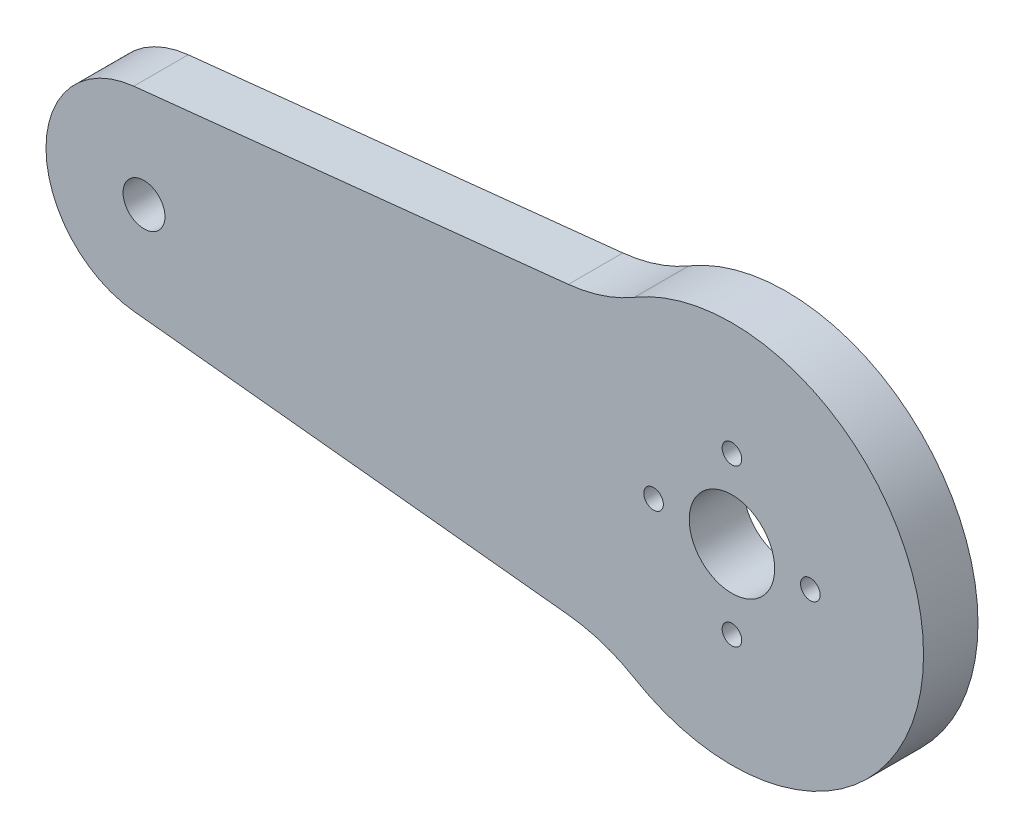
ISO-10303-21;
HEADER;
FILE_DESCRIPTION(('STEP AP214'),'2;1');
FILE_NAME('part.step','',(''),(''),'','','');
FILE_SCHEMA(('AUTOMOTIVE_DESIGN { 1 0 10303 214 1 1 1 1 }'));
ENDSEC;
DATA;
#1=APPLICATION_CONTEXT('core data for automotive mechanical design processes');
#2=APPLICATION_PROTOCOL_DEFINITION('international standard','automotive_design',2000,#1);
#3=PRODUCT_CONTEXT('',#1,'mechanical');
#4=PRODUCT('Part','Part','',(#3));
#5=PRODUCT_RELATED_PRODUCT_CATEGORY('part','',(#4));
#6=PRODUCT_DEFINITION_FORMATION('','',#4);
#7=PRODUCT_DEFINITION_CONTEXT('part definition',#1,'design');
#8=PRODUCT_DEFINITION('design','',#6,#7);
#9=PRODUCT_DEFINITION_SHAPE('','',#8);
#10=(LENGTH_UNIT() NAMED_UNIT(*) SI_UNIT(.MILLI.,.METRE.));
#11=(NAMED_UNIT(*) PLANE_ANGLE_UNIT() SI_UNIT($,.RADIAN.));
#12=(NAMED_UNIT(*) SI_UNIT($,.STERADIAN.) SOLID_ANGLE_UNIT());
#13=UNCERTAINTY_MEASURE_WITH_UNIT(LENGTH_MEASURE(1.E-05),#10,'distance_accuracy_value','');
#14=(GEOMETRIC_REPRESENTATION_CONTEXT(3) GLOBAL_UNCERTAINTY_ASSIGNED_CONTEXT((#13)) GLOBAL_UNIT_ASSIGNED_CONTEXT((#10,
#11,#12)) REPRESENTATION_CONTEXT('',''));
#15=CARTESIAN_POINT('',(0.,0.,0.));
#16=DIRECTION('',(0.,0.,1.));
#17=DIRECTION('',(1.,0.,0.));
#18=AXIS2_PLACEMENT_3D('',#15,#16,#17);
#19=CARTESIAN_POINT('',(-54.,0.,5.));
#20=DIRECTION('',(0.,0.,1.));
#21=DIRECTION('',(1.,0.,0.));
#22=AXIS2_PLACEMENT_3D('',#19,#20,#21);
#23=PLANE('',#22);
#24=CARTESIAN_POINT('',(-16.5876350630029,28.0643967157079,5.));
#25=DIRECTION('',(0.,0.,-1.));
#26=DIRECTION('',(-1.,0.,0.));
#27=AXIS2_PLACEMENT_3D('',#24,#25,#26);
#28=CIRCLE('',#27,15.);
#29=CARTESIAN_POINT('',(-8.95528764137578,15.1513307422227,5.));
#30=VERTEX_POINT('',#29);
#31=CARTESIAN_POINT('',(-15.0197081139881,13.1465682851838,5.));
#32=VERTEX_POINT('',#31);
#33=EDGE_CURVE('E93',#30,#32,#28,.T.);
#34=ORIENTED_EDGE('',*,*,#33,.T.);
#35=DIRECTION('',(0.994521895368273,0.104528463267654,0.));
#36=VECTOR('',#35,1.);
#37=CARTESIAN_POINT('',(-54.9407561694089,8.95069705831445,5.));
#38=LINE('',#37,#36);
#39=CARTESIAN_POINT('',(-54.9407561694089,8.95069705831446,5.));
#40=VERTEX_POINT('',#39);
#41=EDGE_CURVE('E102',#32,#40,#38,.F.);
#42=ORIENTED_EDGE('',*,*,#41,.T.);
#43=CARTESIAN_POINT('',(-54.,0.,5.));
#44=DIRECTION('',(0.,0.,-1.));
#45=DIRECTION('',(-1.,0.,0.));
#46=AXIS2_PLACEMENT_3D('',#43,#44,#45);
#47=CIRCLE('',#46,9.);
#48=CARTESIAN_POINT('',(-54.9407561694089,-8.95069705831446,5.));
#49=VERTEX_POINT('',#48);
#50=EDGE_CURVE('E105',#49,#40,#47,.T.);
#51=ORIENTED_EDGE('',*,*,#50,.F.);
#52=DIRECTION('',(-0.994521895368273,0.104528463267653,0.));
#53=VECTOR('',#52,1.);
#54=CARTESIAN_POINT('',(-54.9407561694089,-8.95069705831446,5.));
#55=LINE('',#54,#53);
#56=CARTESIAN_POINT('',(-15.0197081139882,-13.1465682851838,5.));
#57=VERTEX_POINT('',#56);
#58=EDGE_CURVE('E83',#49,#57,#55,.F.);
#59=ORIENTED_EDGE('',*,*,#58,.T.);
#60=CARTESIAN_POINT('',(-16.587635063003,-28.0643967157079,5.));
#61=DIRECTION('',(0.,0.,-1.));
#62=DIRECTION('',(-1.,0.,0.));
#63=AXIS2_PLACEMENT_3D('',#60,#61,#62);
#64=CIRCLE('',#63,15.);
#65=CARTESIAN_POINT('',(-8.95528764137584,-15.1513307422226,5.));
#66=VERTEX_POINT('',#65);
#67=EDGE_CURVE('E77',#57,#66,#64,.T.);
#68=ORIENTED_EDGE('',*,*,#67,.T.);
#69=CARTESIAN_POINT('',(0.,0.,5.));
#70=DIRECTION('',(0.,0.,-1.));
#71=DIRECTION('',(-1.,0.,0.));
#72=AXIS2_PLACEMENT_3D('',#69,#70,#71);
#73=CIRCLE('',#72,17.6);
#74=EDGE_CURVE('E67',#30,#66,#73,.T.);
#75=ORIENTED_EDGE('',*,*,#74,.F.);
#76=EDGE_LOOP('',(#34,#42,#51,#59,#68,#75));
#77=FACE_BOUND('',#76,.T.);
#78=CARTESIAN_POINT('',(0.,0.,5.));
#79=DIRECTION('',(0.,0.,1.));
#80=DIRECTION('',(1.,0.,0.));
#81=AXIS2_PLACEMENT_3D('',#78,#79,#80);
#82=CIRCLE('',#81,3.925);
#83=CARTESIAN_POINT('',(3.925,0.,5.));
#84=VERTEX_POINT('',#83);
#85=EDGE_CURVE('E101',#84,#84,#82,.F.);
#86=ORIENTED_EDGE('',*,*,#85,.T.);
#87=EDGE_LOOP('',(#86));
#88=FACE_BOUND('',#87,.T.);
#89=CARTESIAN_POINT('',(-54.,0.,5.));
#90=DIRECTION('',(0.,0.,1.));
#91=DIRECTION('',(1.,0.,0.));
#92=AXIS2_PLACEMENT_3D('',#89,#90,#91);
#93=CIRCLE('',#92,1.925);
#94=CARTESIAN_POINT('',(-52.075,0.,5.));
#95=VERTEX_POINT('',#94);
#96=EDGE_CURVE('E138',#95,#95,#93,.F.);
#97=ORIENTED_EDGE('',*,*,#96,.T.);
#98=EDGE_LOOP('',(#97));
#99=FACE_BOUND('',#98,.T.);
#100=CARTESIAN_POINT('',(0.,7.2,5.));
#101=DIRECTION('',(0.,0.,1.));
#102=DIRECTION('',(1.,0.,0.));
#103=AXIS2_PLACEMENT_3D('',#100,#101,#102);
#104=CIRCLE('',#103,0.9);
#105=CARTESIAN_POINT('',(0.9,7.2,5.));
#106=VERTEX_POINT('',#105);
#107=EDGE_CURVE('E141',#106,#106,#104,.F.);
#108=ORIENTED_EDGE('',*,*,#107,.T.);
#109=EDGE_LOOP('',(#108));
#110=FACE_BOUND('',#109,.T.);
#111=CARTESIAN_POINT('',(0.,-7.2,5.));
#112=DIRECTION('',(0.,0.,1.));
#113=DIRECTION('',(1.,0.,0.));
#114=AXIS2_PLACEMENT_3D('',#111,#112,#113);
#115=CIRCLE('',#114,0.9);
#116=CARTESIAN_POINT('',(0.9,-7.2,5.));
#117=VERTEX_POINT('',#116);
#118=EDGE_CURVE('E144',#117,#117,#115,.F.);
#119=ORIENTED_EDGE('',*,*,#118,.T.);
#120=EDGE_LOOP('',(#119));
#121=FACE_BOUND('',#120,.T.);
#122=CARTESIAN_POINT('',(7.2,0.,5.));
#123=DIRECTION('',(0.,0.,1.));
#124=DIRECTION('',(1.,0.,0.));
#125=AXIS2_PLACEMENT_3D('',#122,#123,#124);
#126=CIRCLE('',#125,0.9);
#127=CARTESIAN_POINT('',(8.1,0.,5.));
#128=VERTEX_POINT('',#127);
#129=EDGE_CURVE('E146',#128,#128,#126,.F.);
#130=ORIENTED_EDGE('',*,*,#129,.T.);
#131=EDGE_LOOP('',(#130));
#132=FACE_BOUND('',#131,.T.);
#133=CARTESIAN_POINT('',(-7.2,0.,5.));
#134=DIRECTION('',(0.,0.,1.));
#135=DIRECTION('',(1.,0.,0.));
#136=AXIS2_PLACEMENT_3D('',#133,#134,#135);
#137=CIRCLE('',#136,0.9);
#138=CARTESIAN_POINT('',(-6.3,0.,5.));
#139=VERTEX_POINT('',#138);
#140=EDGE_CURVE('E20',#139,#139,#137,.F.);
#141=ORIENTED_EDGE('',*,*,#140,.T.);
#142=EDGE_LOOP('',(#141));
#143=FACE_BOUND('',#142,.T.);
#144=ADVANCED_FACE('F17',(#77,#88,#99,#110,#121,#132,#143),#23,.T.);
#145=CARTESIAN_POINT('',(-7.2,0.,-0.799999999999999));
#146=DIRECTION('',(0.,0.,1.));
#147=DIRECTION('',(1.,0.,0.));
#148=AXIS2_PLACEMENT_3D('',#145,#146,#147);
#149=CYLINDRICAL_SURFACE('',#148,0.9);
#150=CARTESIAN_POINT('',(-7.2,0.,0.));
#151=DIRECTION('',(0.,0.,1.));
#152=DIRECTION('',(1.,0.,0.));
#153=AXIS2_PLACEMENT_3D('',#150,#151,#152);
#154=CIRCLE('',#153,0.9);
#155=CARTESIAN_POINT('',(-6.3,0.,0.));
#156=VERTEX_POINT('',#155);
#157=EDGE_CURVE('E130',#156,#156,#154,.F.);
#158=ORIENTED_EDGE('',*,*,#157,.T.);
#159=EDGE_LOOP('',(#158));
#160=FACE_BOUND('',#159,.T.);
#161=ORIENTED_EDGE('',*,*,#140,.F.);
#162=EDGE_LOOP('',(#161));
#163=FACE_BOUND('',#162,.T.);
#164=ADVANCED_FACE('F154',(#160,#163),#149,.F.);
#165=CARTESIAN_POINT('',(7.2,0.,-0.799999999999999));
#166=DIRECTION('',(0.,0.,1.));
#167=DIRECTION('',(1.,0.,0.));
#168=AXIS2_PLACEMENT_3D('',#165,#166,#167);
#169=CYLINDRICAL_SURFACE('',#168,0.9);
#170=CARTESIAN_POINT('',(7.2,0.,0.));
#171=DIRECTION('',(0.,0.,1.));
#172=DIRECTION('',(1.,0.,0.));
#173=AXIS2_PLACEMENT_3D('',#170,#171,#172);
#174=CIRCLE('',#173,0.9);
#175=CARTESIAN_POINT('',(8.1,0.,0.));
#176=VERTEX_POINT('',#175);
#177=EDGE_CURVE('E127',#176,#176,#174,.F.);
#178=ORIENTED_EDGE('',*,*,#177,.T.);
#179=EDGE_LOOP('',(#178));
#180=FACE_BOUND('',#179,.T.);
#181=ORIENTED_EDGE('',*,*,#129,.F.);
#182=EDGE_LOOP('',(#181));
#183=FACE_BOUND('',#182,.T.);
#184=ADVANCED_FACE('F156',(#180,#183),#169,.F.);
#185=CARTESIAN_POINT('',(0.,-7.2,-0.799999999999999));
#186=DIRECTION('',(0.,0.,1.));
#187=DIRECTION('',(1.,0.,0.));
#188=AXIS2_PLACEMENT_3D('',#185,#186,#187);
#189=CYLINDRICAL_SURFACE('',#188,0.9);
#190=CARTESIAN_POINT('',(0.,-7.2,0.));
#191=DIRECTION('',(0.,0.,1.));
#192=DIRECTION('',(1.,0.,0.));
#193=AXIS2_PLACEMENT_3D('',#190,#191,#192);
#194=CIRCLE('',#193,0.9);
#195=CARTESIAN_POINT('',(0.9,-7.2,0.));
#196=VERTEX_POINT('',#195);
#197=EDGE_CURVE('E124',#196,#196,#194,.F.);
#198=ORIENTED_EDGE('',*,*,#197,.T.);
#199=EDGE_LOOP('',(#198));
#200=FACE_BOUND('',#199,.T.);
#201=ORIENTED_EDGE('',*,*,#118,.F.);
#202=EDGE_LOOP('',(#201));
#203=FACE_BOUND('',#202,.T.);
#204=ADVANCED_FACE('F163',(#200,#203),#189,.F.);
#205=CARTESIAN_POINT('',(0.,7.2,-0.799999999999999));
#206=DIRECTION('',(0.,0.,1.));
#207=DIRECTION('',(1.,0.,0.));
#208=AXIS2_PLACEMENT_3D('',#205,#206,#207);
#209=CYLINDRICAL_SURFACE('',#208,0.9);
#210=CARTESIAN_POINT('',(0.,7.2,0.));
#211=DIRECTION('',(0.,0.,1.));
#212=DIRECTION('',(1.,0.,0.));
#213=AXIS2_PLACEMENT_3D('',#210,#211,#212);
#214=CIRCLE('',#213,0.9);
#215=CARTESIAN_POINT('',(0.9,7.2,0.));
#216=VERTEX_POINT('',#215);
#217=EDGE_CURVE('E121',#216,#216,#214,.F.);
#218=ORIENTED_EDGE('',*,*,#217,.T.);
#219=EDGE_LOOP('',(#218));
#220=FACE_BOUND('',#219,.T.);
#221=ORIENTED_EDGE('',*,*,#107,.F.);
#222=EDGE_LOOP('',(#221));
#223=FACE_BOUND('',#222,.T.);
#224=ADVANCED_FACE('F200',(#220,#223),#209,.F.);
#225=CARTESIAN_POINT('',(-54.,0.,-0.799999999999999));
#226=DIRECTION('',(0.,0.,1.));
#227=DIRECTION('',(1.,0.,0.));
#228=AXIS2_PLACEMENT_3D('',#225,#226,#227);
#229=CYLINDRICAL_SURFACE('',#228,1.925);
#230=CARTESIAN_POINT('',(-54.,0.,0.));
#231=DIRECTION('',(0.,0.,1.));
#232=DIRECTION('',(1.,0.,0.));
#233=AXIS2_PLACEMENT_3D('',#230,#231,#232);
#234=CIRCLE('',#233,1.925);
#235=CARTESIAN_POINT('',(-52.075,0.,0.));
#236=VERTEX_POINT('',#235);
#237=EDGE_CURVE('E118',#236,#236,#234,.F.);
#238=ORIENTED_EDGE('',*,*,#237,.T.);
#239=EDGE_LOOP('',(#238));
#240=FACE_BOUND('',#239,.T.);
#241=ORIENTED_EDGE('',*,*,#96,.F.);
#242=EDGE_LOOP('',(#241));
#243=FACE_BOUND('',#242,.T.);
#244=ADVANCED_FACE('F196',(#240,#243),#229,.F.);
#245=CARTESIAN_POINT('',(0.,0.,-0.799999999999999));
#246=DIRECTION('',(0.,0.,1.));
#247=DIRECTION('',(1.,0.,0.));
#248=AXIS2_PLACEMENT_3D('',#245,#246,#247);
#249=CYLINDRICAL_SURFACE('',#248,3.925);
#250=CARTESIAN_POINT('',(0.,0.,0.));
#251=DIRECTION('',(0.,0.,1.));
#252=DIRECTION('',(1.,0.,0.));
#253=AXIS2_PLACEMENT_3D('',#250,#251,#252);
#254=CIRCLE('',#253,3.925);
#255=CARTESIAN_POINT('',(3.925,0.,0.));
#256=VERTEX_POINT('',#255);
#257=EDGE_CURVE('E115',#256,#256,#254,.F.);
#258=ORIENTED_EDGE('',*,*,#257,.T.);
#259=EDGE_LOOP('',(#258));
#260=FACE_BOUND('',#259,.T.);
#261=ORIENTED_EDGE('',*,*,#85,.F.);
#262=EDGE_LOOP('',(#261));
#263=FACE_BOUND('',#262,.T.);
#264=ADVANCED_FACE('F192',(#260,#263),#249,.F.);
#265=CARTESIAN_POINT('',(-54.9407561694089,-8.95069705831446,5.));
#266=DIRECTION('',(0.104528463267653,0.994521895368273,0.));
#267=DIRECTION('',(-0.994521895368273,0.104528463267653,0.));
#268=AXIS2_PLACEMENT_3D('',#265,#266,#267);
#269=PLANE('',#268);
#270=DIRECTION('',(0.,0.,-1.));
#271=VECTOR('',#270,1.);
#272=CARTESIAN_POINT('',(-15.0197081139882,-13.1465682851838,5.));
#273=LINE('',#272,#271);
#274=CARTESIAN_POINT('',(-15.0197081139882,-13.1465682851838,0.));
#275=VERTEX_POINT('',#274);
#276=EDGE_CURVE('E86',#275,#57,#273,.F.);
#277=ORIENTED_EDGE('',*,*,#276,.T.);
#278=ORIENTED_EDGE('',*,*,#58,.F.);
#279=DIRECTION('',(0.,0.,1.));
#280=VECTOR('',#279,1.);
#281=CARTESIAN_POINT('',(-54.9407561694089,-8.95069705831446,5.));
#282=LINE('',#281,#280);
#283=CARTESIAN_POINT('',(-54.9407561694089,-8.95069705831446,0.));
#284=VERTEX_POINT('',#283);
#285=EDGE_CURVE('E98',#284,#49,#282,.T.);
#286=ORIENTED_EDGE('',*,*,#285,.F.);
#287=DIRECTION('',(0.994521895368273,-0.104528463267653,0.));
#288=VECTOR('',#287,1.);
#289=CARTESIAN_POINT('',(-54.9407561694089,-8.95069705831446,0.));
#290=LINE('',#289,#288);
#291=EDGE_CURVE('E113',#284,#275,#290,.T.);
#292=ORIENTED_EDGE('',*,*,#291,.T.);
#293=EDGE_LOOP('',(#277,#278,#286,#292));
#294=FACE_BOUND('',#293,.T.);
#295=ADVANCED_FACE('F189',(#294),#269,.F.);
#296=CARTESIAN_POINT('',(-16.587635063003,-28.0643967157079,5.));
#297=DIRECTION('',(0.,0.,-1.));
#298=DIRECTION('',(-1.,0.,0.));
#299=AXIS2_PLACEMENT_3D('',#296,#297,#298);
#300=CYLINDRICAL_SURFACE('',#299,15.);
#301=ORIENTED_EDGE('',*,*,#276,.F.);
#302=CARTESIAN_POINT('',(-16.587635063003,-28.0643967157079,0.));
#303=DIRECTION('',(0.,0.,-1.));
#304=DIRECTION('',(-1.,0.,0.));
#305=AXIS2_PLACEMENT_3D('',#302,#303,#304);
#306=CIRCLE('',#305,15.);
#307=CARTESIAN_POINT('',(-8.95528764137584,-15.1513307422226,0.));
#308=VERTEX_POINT('',#307);
#309=EDGE_CURVE('E91',#275,#308,#306,.T.);
#310=ORIENTED_EDGE('',*,*,#309,.T.);
#311=DIRECTION('',(0.,0.,-1.));
#312=VECTOR('',#311,1.);
#313=CARTESIAN_POINT('',(-8.95528764137583,-15.1513307422227,5.));
#314=LINE('',#313,#312);
#315=EDGE_CURVE('E72',#66,#308,#314,.T.);
#316=ORIENTED_EDGE('',*,*,#315,.F.);
#317=ORIENTED_EDGE('',*,*,#67,.F.);
#318=EDGE_LOOP('',(#301,#310,#316,#317));
#319=FACE_BOUND('',#318,.T.);
#320=ADVANCED_FACE('F89',(#319),#300,.F.);
#321=CARTESIAN_POINT('',(0.,0.,5.));
#322=DIRECTION('',(0.,0.,-1.));
#323=DIRECTION('',(-1.,0.,0.));
#324=AXIS2_PLACEMENT_3D('',#321,#322,#323);
#325=CYLINDRICAL_SURFACE('',#324,17.6);
#326=CARTESIAN_POINT('',(0.,0.,0.));
#327=DIRECTION('',(0.,0.,-1.));
#328=DIRECTION('',(-1.,0.,0.));
#329=AXIS2_PLACEMENT_3D('',#326,#327,#328);
#330=CIRCLE('',#329,17.6);
#331=CARTESIAN_POINT('',(-8.95528764137578,15.1513307422227,0.));
#332=VERTEX_POINT('',#331);
#333=EDGE_CURVE('E110',#308,#332,#330,.F.);
#334=ORIENTED_EDGE('',*,*,#333,.T.);
#335=DIRECTION('',(0.,0.,-1.));
#336=VECTOR('',#335,1.);
#337=CARTESIAN_POINT('',(-8.95528764137578,15.1513307422227,5.));
#338=LINE('',#337,#336);
#339=EDGE_CURVE('E74',#332,#30,#338,.F.);
#340=ORIENTED_EDGE('',*,*,#339,.T.);
#341=ORIENTED_EDGE('',*,*,#74,.T.);
#342=ORIENTED_EDGE('',*,*,#315,.T.);
#343=EDGE_LOOP('',(#334,#340,#341,#342));
#344=FACE_BOUND('',#343,.T.);
#345=ADVANCED_FACE('F70',(#344),#325,.T.);
#346=CARTESIAN_POINT('',(-16.5876350630029,28.0643967157079,5.));
#347=DIRECTION('',(0.,0.,-1.));
#348=DIRECTION('',(-1.,0.,0.));
#349=AXIS2_PLACEMENT_3D('',#346,#347,#348);
#350=CYLINDRICAL_SURFACE('',#349,15.);
#351=ORIENTED_EDGE('',*,*,#339,.F.);
#352=CARTESIAN_POINT('',(-16.5876350630029,28.0643967157079,0.));
#353=DIRECTION('',(0.,0.,-1.));
#354=DIRECTION('',(-1.,0.,0.));
#355=AXIS2_PLACEMENT_3D('',#352,#353,#354);
#356=CIRCLE('',#355,15.);
#357=CARTESIAN_POINT('',(-15.0197081139881,13.1465682851838,0.));
#358=VERTEX_POINT('',#357);
#359=EDGE_CURVE('E26',#332,#358,#356,.T.);
#360=ORIENTED_EDGE('',*,*,#359,.T.);
#361=DIRECTION('',(0.,0.,1.));
#362=VECTOR('',#361,1.);
#363=CARTESIAN_POINT('',(-15.019708113988,13.1465682851838,5.));
#364=LINE('',#363,#362);
#365=EDGE_CURVE('E106',#358,#32,#364,.T.);
#366=ORIENTED_EDGE('',*,*,#365,.T.);
#367=ORIENTED_EDGE('',*,*,#33,.F.);
#368=EDGE_LOOP('',(#351,#360,#366,#367));
#369=FACE_BOUND('',#368,.T.);
#370=ADVANCED_FACE('F180',(#369),#350,.F.);
#371=CARTESIAN_POINT('',(-54.9407561694089,8.95069705831445,5.));
#372=DIRECTION('',(0.104528463267654,-0.994521895368273,0.));
#373=DIRECTION('',(0.994521895368273,0.104528463267654,0.));
#374=AXIS2_PLACEMENT_3D('',#371,#372,#373);
#375=PLANE('',#374);
#376=ORIENTED_EDGE('',*,*,#365,.F.);
#377=DIRECTION('',(-0.994521895368273,-0.104528463267654,0.));
#378=VECTOR('',#377,1.);
#379=CARTESIAN_POINT('',(-15.0197081139881,13.1465682851838,0.));
#380=LINE('',#379,#378);
#381=CARTESIAN_POINT('',(-54.9407561694089,8.95069705831446,0.));
#382=VERTEX_POINT('',#381);
#383=EDGE_CURVE('E11',#358,#382,#380,.T.);
#384=ORIENTED_EDGE('',*,*,#383,.T.);
#385=DIRECTION('',(0.,0.,-1.));
#386=VECTOR('',#385,1.);
#387=CARTESIAN_POINT('',(-54.9407561694089,8.95069705831446,5.));
#388=LINE('',#387,#386);
#389=EDGE_CURVE('E133',#40,#382,#388,.T.);
#390=ORIENTED_EDGE('',*,*,#389,.F.);
#391=ORIENTED_EDGE('',*,*,#41,.F.);
#392=EDGE_LOOP('',(#376,#384,#390,#391));
#393=FACE_BOUND('',#392,.T.);
#394=ADVANCED_FACE('F173',(#393),#375,.F.);
#395=CARTESIAN_POINT('',(-54.,0.,5.));
#396=DIRECTION('',(0.,0.,-1.));
#397=DIRECTION('',(-1.,0.,0.));
#398=AXIS2_PLACEMENT_3D('',#395,#396,#397);
#399=CYLINDRICAL_SURFACE('',#398,9.);
#400=ORIENTED_EDGE('',*,*,#389,.T.);
#401=CARTESIAN_POINT('',(-54.,0.,0.));
#402=DIRECTION('',(0.,0.,-1.));
#403=DIRECTION('',(-1.,0.,0.));
#404=AXIS2_PLACEMENT_3D('',#401,#402,#403);
#405=CIRCLE('',#404,9.);
#406=EDGE_CURVE('E35',#382,#284,#405,.F.);
#407=ORIENTED_EDGE('',*,*,#406,.T.);
#408=ORIENTED_EDGE('',*,*,#285,.T.);
#409=ORIENTED_EDGE('',*,*,#50,.T.);
#410=EDGE_LOOP('',(#400,#407,#408,#409));
#411=FACE_BOUND('',#410,.T.);
#412=ADVANCED_FACE('F168',(#411),#399,.T.);
#413=CARTESIAN_POINT('',(-54.,0.,0.));
#414=DIRECTION('',(0.,0.,1.));
#415=DIRECTION('',(1.,0.,0.));
#416=AXIS2_PLACEMENT_3D('',#413,#414,#415);
#417=PLANE('',#416);
#418=ORIENTED_EDGE('',*,*,#383,.F.);
#419=ORIENTED_EDGE('',*,*,#359,.F.);
#420=ORIENTED_EDGE('',*,*,#333,.F.);
#421=ORIENTED_EDGE('',*,*,#309,.F.);
#422=ORIENTED_EDGE('',*,*,#291,.F.);
#423=ORIENTED_EDGE('',*,*,#406,.F.);
#424=EDGE_LOOP('',(#418,#419,#420,#421,#422,#423));
#425=FACE_BOUND('',#424,.T.);
#426=ORIENTED_EDGE('',*,*,#257,.F.);
#427=EDGE_LOOP('',(#426));
#428=FACE_BOUND('',#427,.T.);
#429=ORIENTED_EDGE('',*,*,#237,.F.);
#430=EDGE_LOOP('',(#429));
#431=FACE_BOUND('',#430,.T.);
#432=ORIENTED_EDGE('',*,*,#217,.F.);
#433=EDGE_LOOP('',(#432));
#434=FACE_BOUND('',#433,.T.);
#435=ORIENTED_EDGE('',*,*,#197,.F.);
#436=EDGE_LOOP('',(#435));
#437=FACE_BOUND('',#436,.T.);
#438=ORIENTED_EDGE('',*,*,#177,.F.);
#439=EDGE_LOOP('',(#438));
#440=FACE_BOUND('',#439,.T.);
#441=ORIENTED_EDGE('',*,*,#157,.F.);
#442=EDGE_LOOP('',(#441));
#443=FACE_BOUND('',#442,.T.);
#444=ADVANCED_FACE('F166',(#425,#428,#431,#434,#437,#440,#443),#417,.F.);
#445=CLOSED_SHELL('',(#144,#164,#184,#204,#224,#244,#264,#295,#320,#345,#370,#394,#412,#444));
#446=MANIFOLD_SOLID_BREP('B1',#445);
#447=ADVANCED_BREP_SHAPE_REPRESENTATION('',(#18,#446),#14);
#448=SHAPE_DEFINITION_REPRESENTATION(#9,#447);
ENDSEC;
END-ISO-10303-21;
